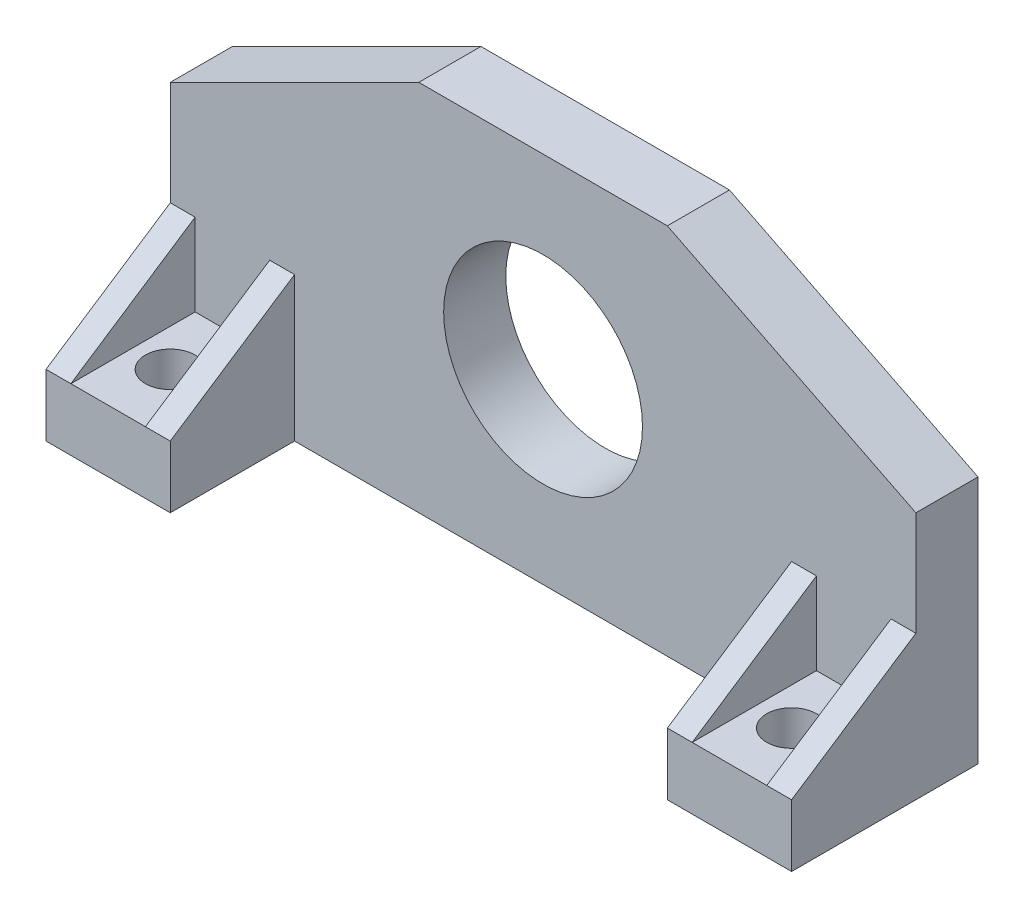
ISO-10303-21;
HEADER;
FILE_DESCRIPTION(('STEP AP214'),'2;1');
FILE_NAME('part.step','',(''),(''),'','','');
FILE_SCHEMA(('AUTOMOTIVE_DESIGN { 1 0 10303 214 1 1 1 1 }'));
ENDSEC;
DATA;
#1=APPLICATION_CONTEXT('core data for automotive mechanical design processes');
#2=APPLICATION_PROTOCOL_DEFINITION('international standard','automotive_design',2000,#1);
#3=PRODUCT_CONTEXT('',#1,'mechanical');
#4=PRODUCT('Part','Part','',(#3));
#5=PRODUCT_RELATED_PRODUCT_CATEGORY('part','',(#4));
#6=PRODUCT_DEFINITION_FORMATION('','',#4);
#7=PRODUCT_DEFINITION_CONTEXT('part definition',#1,'design');
#8=PRODUCT_DEFINITION('design','',#6,#7);
#9=PRODUCT_DEFINITION_SHAPE('','',#8);
#10=(LENGTH_UNIT() NAMED_UNIT(*) SI_UNIT(.MILLI.,.METRE.));
#11=(NAMED_UNIT(*) PLANE_ANGLE_UNIT() SI_UNIT($,.RADIAN.));
#12=(NAMED_UNIT(*) SI_UNIT($,.STERADIAN.) SOLID_ANGLE_UNIT());
#13=UNCERTAINTY_MEASURE_WITH_UNIT(LENGTH_MEASURE(1.E-05),#10,'distance_accuracy_value','');
#14=(GEOMETRIC_REPRESENTATION_CONTEXT(3) GLOBAL_UNCERTAINTY_ASSIGNED_CONTEXT((#13)) GLOBAL_UNIT_ASSIGNED_CONTEXT((#10,
#11,#12)) REPRESENTATION_CONTEXT('',''));
#15=CARTESIAN_POINT('',(0.,0.,0.));
#16=DIRECTION('',(0.,0.,1.));
#17=DIRECTION('',(1.,0.,0.));
#18=AXIS2_PLACEMENT_3D('',#15,#16,#17);
#19=CARTESIAN_POINT('',(0.,0.,5.));
#20=DIRECTION('',(0.,0.,-1.));
#21=DIRECTION('',(-1.,0.,0.));
#22=AXIS2_PLACEMENT_3D('',#19,#20,#21);
#23=PLANE('',#22);
#24=CARTESIAN_POINT('',(30.,15.,5.));
#25=DIRECTION('',(0.,0.,1.));
#26=DIRECTION('',(1.,0.,0.));
#27=AXIS2_PLACEMENT_3D('',#24,#25,#26);
#28=CIRCLE('',#27,8.);
#29=CARTESIAN_POINT('',(38.,15.,5.));
#30=VERTEX_POINT('',#29);
#31=EDGE_CURVE('E319',#30,#30,#28,.T.);
#32=ORIENTED_EDGE('',*,*,#31,.F.);
#33=EDGE_LOOP('',(#32));
#34=FACE_BOUND('',#33,.T.);
#35=DIRECTION('',(-0.894427190999916,0.447213595499957,0.));
#36=VECTOR('',#35,1.);
#37=CARTESIAN_POINT('',(40.,30.,5.));
#38=LINE('',#37,#36);
#39=CARTESIAN_POINT('',(60.,20.,5.));
#40=VERTEX_POINT('',#39);
#41=CARTESIAN_POINT('',(40.,30.,5.));
#42=VERTEX_POINT('',#41);
#43=EDGE_CURVE('E163',#40,#42,#38,.T.);
#44=ORIENTED_EDGE('',*,*,#43,.T.);
#45=DIRECTION('',(-1.,0.,0.));
#46=VECTOR('',#45,1.);
#47=CARTESIAN_POINT('',(0.,30.,5.));
#48=LINE('',#47,#46);
#49=CARTESIAN_POINT('',(20.,30.,5.));
#50=VERTEX_POINT('',#49);
#51=EDGE_CURVE('E167',#42,#50,#48,.T.);
#52=ORIENTED_EDGE('',*,*,#51,.T.);
#53=DIRECTION('',(0.894427190999916,0.447213595499958,0.));
#54=VECTOR('',#53,1.);
#55=CARTESIAN_POINT('',(20.,30.,5.));
#56=LINE('',#55,#54);
#57=CARTESIAN_POINT('',(0.,20.,5.));
#58=VERTEX_POINT('',#57);
#59=EDGE_CURVE('E203',#58,#50,#56,.T.);
#60=ORIENTED_EDGE('',*,*,#59,.F.);
#61=DIRECTION('',(0.,-1.,0.));
#62=VECTOR('',#61,1.);
#63=CARTESIAN_POINT('',(0.,0.,5.));
#64=LINE('',#63,#62);
#65=CARTESIAN_POINT('',(0.,11.6051878718082,5.));
#66=VERTEX_POINT('',#65);
#67=EDGE_CURVE('E173',#58,#66,#64,.T.);
#68=ORIENTED_EDGE('',*,*,#67,.T.);
#69=DIRECTION('',(-1.,0.,0.));
#70=VECTOR('',#69,1.);
#71=CARTESIAN_POINT('',(1.99999999999999,11.6051878718082,5.));
#72=LINE('',#71,#70);
#73=CARTESIAN_POINT('',(1.99999999999999,11.6051878718082,5.));
#74=VERTEX_POINT('',#73);
#75=EDGE_CURVE('E263',#74,#66,#72,.T.);
#76=ORIENTED_EDGE('',*,*,#75,.F.);
#77=DIRECTION('',(0.,-1.,0.));
#78=VECTOR('',#77,1.);
#79=CARTESIAN_POINT('',(1.99999999999999,11.6051878718082,5.));
#80=LINE('',#79,#78);
#81=CARTESIAN_POINT('',(2.,4.99999999999997,5.));
#82=VERTEX_POINT('',#81);
#83=EDGE_CURVE('E261',#74,#82,#80,.T.);
#84=ORIENTED_EDGE('',*,*,#83,.T.);
#85=DIRECTION('',(1.,0.,0.));
#86=VECTOR('',#85,1.);
#87=CARTESIAN_POINT('',(0.,4.99999999999997,5.));
#88=LINE('',#87,#86);
#89=CARTESIAN_POINT('',(8.,4.99999999999998,5.));
#90=VERTEX_POINT('',#89);
#91=EDGE_CURVE('E284',#82,#90,#88,.T.);
#92=ORIENTED_EDGE('',*,*,#91,.T.);
#93=DIRECTION('',(0.,-1.,0.));
#94=VECTOR('',#93,1.);
#95=CARTESIAN_POINT('',(7.99999999999999,11.6051878718082,5.));
#96=LINE('',#95,#94);
#97=CARTESIAN_POINT('',(7.99999999999999,11.6051878718082,5.));
#98=VERTEX_POINT('',#97);
#99=EDGE_CURVE('E240',#98,#90,#96,.T.);
#100=ORIENTED_EDGE('',*,*,#99,.F.);
#101=DIRECTION('',(1.,0.,0.));
#102=VECTOR('',#101,1.);
#103=CARTESIAN_POINT('',(7.99999999999999,11.6051878718082,5.));
#104=LINE('',#103,#102);
#105=CARTESIAN_POINT('',(9.99999999999999,11.6051878718082,5.));
#106=VERTEX_POINT('',#105);
#107=EDGE_CURVE('E246',#98,#106,#104,.T.);
#108=ORIENTED_EDGE('',*,*,#107,.T.);
#109=DIRECTION('',(0.,-1.,0.));
#110=VECTOR('',#109,1.);
#111=CARTESIAN_POINT('',(10.,0.,5.));
#112=LINE('',#111,#110);
#113=CARTESIAN_POINT('',(10.,0.,5.));
#114=VERTEX_POINT('',#113);
#115=EDGE_CURVE('E280',#106,#114,#112,.T.);
#116=ORIENTED_EDGE('',*,*,#115,.T.);
#117=DIRECTION('',(1.,0.,0.));
#118=VECTOR('',#117,1.);
#119=CARTESIAN_POINT('',(0.,0.,5.));
#120=LINE('',#119,#118);
#121=CARTESIAN_POINT('',(50.,0.,5.));
#122=VERTEX_POINT('',#121);
#123=EDGE_CURVE('E176',#114,#122,#120,.T.);
#124=ORIENTED_EDGE('',*,*,#123,.T.);
#125=DIRECTION('',(0.,-1.,0.));
#126=VECTOR('',#125,1.);
#127=CARTESIAN_POINT('',(50.,0.,5.));
#128=LINE('',#127,#126);
#129=CARTESIAN_POINT('',(50.,11.6051878718082,5.));
#130=VERTEX_POINT('',#129);
#131=EDGE_CURVE('E305',#130,#122,#128,.T.);
#132=ORIENTED_EDGE('',*,*,#131,.F.);
#133=DIRECTION('',(-1.,0.,0.));
#134=VECTOR('',#133,1.);
#135=CARTESIAN_POINT('',(52.,11.6051878718082,5.));
#136=LINE('',#135,#134);
#137=CARTESIAN_POINT('',(52.,11.6051878718082,5.));
#138=VERTEX_POINT('',#137);
#139=EDGE_CURVE('E231',#138,#130,#136,.T.);
#140=ORIENTED_EDGE('',*,*,#139,.F.);
#141=DIRECTION('',(0.,-1.,0.));
#142=VECTOR('',#141,1.);
#143=CARTESIAN_POINT('',(52.,11.6051878718082,5.));
#144=LINE('',#143,#142);
#145=CARTESIAN_POINT('',(52.,5.00000000000001,5.));
#146=VERTEX_POINT('',#145);
#147=EDGE_CURVE('E227',#138,#146,#144,.T.);
#148=ORIENTED_EDGE('',*,*,#147,.T.);
#149=DIRECTION('',(-1.,0.,0.));
#150=VECTOR('',#149,1.);
#151=CARTESIAN_POINT('',(60.,5.,5.));
#152=LINE('',#151,#150);
#153=CARTESIAN_POINT('',(58.,5.00000000000001,5.));
#154=VERTEX_POINT('',#153);
#155=EDGE_CURVE('E300',#154,#146,#152,.T.);
#156=ORIENTED_EDGE('',*,*,#155,.F.);
#157=DIRECTION('',(0.,-1.,0.));
#158=VECTOR('',#157,1.);
#159=CARTESIAN_POINT('',(58.,11.6051878718082,5.));
#160=LINE('',#159,#158);
#161=CARTESIAN_POINT('',(58.,11.6051878718082,5.));
#162=VERTEX_POINT('',#161);
#163=EDGE_CURVE('E210',#162,#154,#160,.T.);
#164=ORIENTED_EDGE('',*,*,#163,.F.);
#165=DIRECTION('',(1.,0.,0.));
#166=VECTOR('',#165,1.);
#167=CARTESIAN_POINT('',(58.,11.6051878718082,5.));
#168=LINE('',#167,#166);
#169=CARTESIAN_POINT('',(60.,11.6051878718082,5.));
#170=VERTEX_POINT('',#169);
#171=EDGE_CURVE('E208',#162,#170,#168,.T.);
#172=ORIENTED_EDGE('',*,*,#171,.T.);
#173=DIRECTION('',(0.,1.,0.));
#174=VECTOR('',#173,1.);
#175=CARTESIAN_POINT('',(60.,0.,5.));
#176=LINE('',#175,#174);
#177=EDGE_CURVE('E184',#170,#40,#176,.T.);
#178=ORIENTED_EDGE('',*,*,#177,.T.);
#179=EDGE_LOOP('',(#44,#52,#60,#68,#76,#84,#92,#100,#108,#116,#124,#132,#140,#148,#156,#164,
#172,#178));
#180=FACE_BOUND('',#179,.T.);
#181=ADVANCED_FACE('F32',(#34,#180),#23,.F.);
#182=CARTESIAN_POINT('',(60.,0.,5.));
#183=DIRECTION('',(-1.,0.,0.));
#184=DIRECTION('',(0.,-1.,0.));
#185=AXIS2_PLACEMENT_3D('',#182,#183,#184);
#186=PLANE('',#185);
#187=DIRECTION('',(0.,0.,1.));
#188=VECTOR('',#187,1.);
#189=CARTESIAN_POINT('',(60.,20.,0.));
#190=LINE('',#189,#188);
#191=CARTESIAN_POINT('',(60.,20.,0.));
#192=VERTEX_POINT('',#191);
#193=EDGE_CURVE('E47',#192,#40,#190,.T.);
#194=ORIENTED_EDGE('',*,*,#193,.T.);
#195=ORIENTED_EDGE('',*,*,#177,.F.);
#196=DIRECTION('',(0.,0.55114370580762,-0.834410340029798));
#197=VECTOR('',#196,1.);
#198=CARTESIAN_POINT('',(60.,5.,15.));
#199=LINE('',#198,#197);
#200=CARTESIAN_POINT('',(60.,5.,15.));
#201=VERTEX_POINT('',#200);
#202=EDGE_CURVE('E222',#201,#170,#199,.T.);
#203=ORIENTED_EDGE('',*,*,#202,.F.);
#204=DIRECTION('',(0.,1.,0.));
#205=VECTOR('',#204,1.);
#206=CARTESIAN_POINT('',(60.,0.,15.));
#207=LINE('',#206,#205);
#208=CARTESIAN_POINT('',(60.,0.,15.));
#209=VERTEX_POINT('',#208);
#210=EDGE_CURVE('E301',#209,#201,#207,.T.);
#211=ORIENTED_EDGE('',*,*,#210,.F.);
#212=DIRECTION('',(0.,0.,-1.));
#213=VECTOR('',#212,1.);
#214=CARTESIAN_POINT('',(60.,0.,5.));
#215=LINE('',#214,#213);
#216=CARTESIAN_POINT('',(60.,0.,0.));
#217=VERTEX_POINT('',#216);
#218=EDGE_CURVE('E40',#209,#217,#215,.T.);
#219=ORIENTED_EDGE('',*,*,#218,.T.);
#220=DIRECTION('',(0.,1.,0.));
#221=VECTOR('',#220,1.);
#222=CARTESIAN_POINT('',(60.,0.,0.));
#223=LINE('',#222,#221);
#224=EDGE_CURVE('E174',#217,#192,#223,.T.);
#225=ORIENTED_EDGE('',*,*,#224,.T.);
#226=EDGE_LOOP('',(#194,#195,#203,#211,#219,#225));
#227=FACE_BOUND('',#226,.T.);
#228=ADVANCED_FACE('F201',(#227),#186,.F.);
#229=CARTESIAN_POINT('',(0.,30.,5.));
#230=DIRECTION('',(0.,-1.,0.));
#231=DIRECTION('',(0.,0.,-1.));
#232=AXIS2_PLACEMENT_3D('',#229,#230,#231);
#233=PLANE('',#232);
#234=DIRECTION('',(0.,0.,1.));
#235=VECTOR('',#234,1.);
#236=CARTESIAN_POINT('',(40.,30.,0.));
#237=LINE('',#236,#235);
#238=CARTESIAN_POINT('',(40.,30.,0.));
#239=VERTEX_POINT('',#238);
#240=EDGE_CURVE('E158',#239,#42,#237,.T.);
#241=ORIENTED_EDGE('',*,*,#240,.F.);
#242=DIRECTION('',(-1.,0.,0.));
#243=VECTOR('',#242,1.);
#244=CARTESIAN_POINT('',(0.,30.,0.));
#245=LINE('',#244,#243);
#246=CARTESIAN_POINT('',(20.,30.,0.));
#247=VERTEX_POINT('',#246);
#248=EDGE_CURVE('E55',#239,#247,#245,.T.);
#249=ORIENTED_EDGE('',*,*,#248,.T.);
#250=DIRECTION('',(0.,0.,1.));
#251=VECTOR('',#250,1.);
#252=CARTESIAN_POINT('',(20.,30.,0.));
#253=LINE('',#252,#251);
#254=EDGE_CURVE('E332',#247,#50,#253,.T.);
#255=ORIENTED_EDGE('',*,*,#254,.T.);
#256=ORIENTED_EDGE('',*,*,#51,.F.);
#257=EDGE_LOOP('',(#241,#249,#255,#256));
#258=FACE_BOUND('',#257,.T.);
#259=ADVANCED_FACE('F166',(#258),#233,.F.);
#260=CARTESIAN_POINT('',(0.,0.,0.));
#261=DIRECTION('',(0.,0.,-1.));
#262=DIRECTION('',(-1.,0.,0.));
#263=AXIS2_PLACEMENT_3D('',#260,#261,#262);
#264=PLANE('',#263);
#265=CARTESIAN_POINT('',(30.,15.,0.));
#266=DIRECTION('',(0.,0.,1.));
#267=DIRECTION('',(1.,0.,0.));
#268=AXIS2_PLACEMENT_3D('',#265,#266,#267);
#269=CIRCLE('',#268,8.);
#270=CARTESIAN_POINT('',(38.,15.,0.));
#271=VERTEX_POINT('',#270);
#272=EDGE_CURVE('E194',#271,#271,#269,.T.);
#273=ORIENTED_EDGE('',*,*,#272,.T.);
#274=EDGE_LOOP('',(#273));
#275=FACE_BOUND('',#274,.T.);
#276=ORIENTED_EDGE('',*,*,#248,.F.);
#277=DIRECTION('',(-0.894427190999916,0.447213595499957,0.));
#278=VECTOR('',#277,1.);
#279=CARTESIAN_POINT('',(40.,30.,0.));
#280=LINE('',#279,#278);
#281=EDGE_CURVE('E156',#192,#239,#280,.T.);
#282=ORIENTED_EDGE('',*,*,#281,.F.);
#283=ORIENTED_EDGE('',*,*,#224,.F.);
#284=DIRECTION('',(1.,0.,0.));
#285=VECTOR('',#284,1.);
#286=CARTESIAN_POINT('',(0.,0.,0.));
#287=LINE('',#286,#285);
#288=CARTESIAN_POINT('',(0.,0.,0.));
#289=VERTEX_POINT('',#288);
#290=EDGE_CURVE('E178',#289,#217,#287,.T.);
#291=ORIENTED_EDGE('',*,*,#290,.F.);
#292=DIRECTION('',(0.,-1.,0.));
#293=VECTOR('',#292,1.);
#294=CARTESIAN_POINT('',(0.,0.,0.));
#295=LINE('',#294,#293);
#296=CARTESIAN_POINT('',(0.,20.,0.));
#297=VERTEX_POINT('',#296);
#298=EDGE_CURVE('E193',#297,#289,#295,.T.);
#299=ORIENTED_EDGE('',*,*,#298,.F.);
#300=DIRECTION('',(0.894427190999916,0.447213595499958,0.));
#301=VECTOR('',#300,1.);
#302=CARTESIAN_POINT('',(20.,30.,0.));
#303=LINE('',#302,#301);
#304=EDGE_CURVE('E172',#297,#247,#303,.T.);
#305=ORIENTED_EDGE('',*,*,#304,.T.);
#306=EDGE_LOOP('',(#276,#282,#283,#291,#299,#305));
#307=FACE_BOUND('',#306,.T.);
#308=ADVANCED_FACE('F170',(#275,#307),#264,.T.);
#309=CARTESIAN_POINT('',(0.,0.,5.));
#310=DIRECTION('',(1.,0.,0.));
#311=DIRECTION('',(0.,1.,0.));
#312=AXIS2_PLACEMENT_3D('',#309,#310,#311);
#313=PLANE('',#312);
#314=ORIENTED_EDGE('',*,*,#67,.F.);
#315=DIRECTION('',(0.,0.,1.));
#316=VECTOR('',#315,1.);
#317=CARTESIAN_POINT('',(0.,20.,0.));
#318=LINE('',#317,#316);
#319=EDGE_CURVE('E350',#297,#58,#318,.T.);
#320=ORIENTED_EDGE('',*,*,#319,.F.);
#321=ORIENTED_EDGE('',*,*,#298,.T.);
#322=DIRECTION('',(0.,0.,-1.));
#323=VECTOR('',#322,1.);
#324=CARTESIAN_POINT('',(0.,0.,5.));
#325=LINE('',#324,#323);
#326=CARTESIAN_POINT('',(0.,0.,15.));
#327=VERTEX_POINT('',#326);
#328=EDGE_CURVE('E11',#327,#289,#325,.T.);
#329=ORIENTED_EDGE('',*,*,#328,.F.);
#330=DIRECTION('',(0.,1.,0.));
#331=VECTOR('',#330,1.);
#332=CARTESIAN_POINT('',(0.,0.,15.));
#333=LINE('',#332,#331);
#334=CARTESIAN_POINT('',(0.,4.99999999999997,15.));
#335=VERTEX_POINT('',#334);
#336=EDGE_CURVE('E281',#327,#335,#333,.T.);
#337=ORIENTED_EDGE('',*,*,#336,.T.);
#338=DIRECTION('',(0.,0.55114370580762,-0.834410340029798));
#339=VECTOR('',#338,1.);
#340=CARTESIAN_POINT('',(0.,4.99999999999997,15.));
#341=LINE('',#340,#339);
#342=EDGE_CURVE('E252',#335,#66,#341,.T.);
#343=ORIENTED_EDGE('',*,*,#342,.T.);
#344=EDGE_LOOP('',(#314,#320,#321,#329,#337,#343));
#345=FACE_BOUND('',#344,.T.);
#346=ADVANCED_FACE('F34',(#345),#313,.F.);
#347=CARTESIAN_POINT('',(0.,0.,5.));
#348=DIRECTION('',(0.,1.,0.));
#349=DIRECTION('',(0.,0.,1.));
#350=AXIS2_PLACEMENT_3D('',#347,#348,#349);
#351=PLANE('',#350);
#352=CARTESIAN_POINT('',(55.,0.,10.));
#353=DIRECTION('',(0.,1.,0.));
#354=DIRECTION('',(0.,0.,1.));
#355=AXIS2_PLACEMENT_3D('',#352,#353,#354);
#356=CIRCLE('',#355,2.);
#357=CARTESIAN_POINT('',(55.,0.,12.));
#358=VERTEX_POINT('',#357);
#359=EDGE_CURVE('E271',#358,#358,#356,.F.);
#360=ORIENTED_EDGE('',*,*,#359,.F.);
#361=EDGE_LOOP('',(#360));
#362=FACE_BOUND('',#361,.T.);
#363=CARTESIAN_POINT('',(5.,0.,10.));
#364=DIRECTION('',(0.,1.,0.));
#365=DIRECTION('',(0.,0.,1.));
#366=AXIS2_PLACEMENT_3D('',#363,#364,#365);
#367=CIRCLE('',#366,2.);
#368=CARTESIAN_POINT('',(5.,0.,12.));
#369=VERTEX_POINT('',#368);
#370=EDGE_CURVE('E277',#369,#369,#367,.T.);
#371=ORIENTED_EDGE('',*,*,#370,.T.);
#372=EDGE_LOOP('',(#371));
#373=FACE_BOUND('',#372,.T.);
#374=ORIENTED_EDGE('',*,*,#290,.T.);
#375=ORIENTED_EDGE('',*,*,#218,.F.);
#376=DIRECTION('',(1.,0.,0.));
#377=VECTOR('',#376,1.);
#378=CARTESIAN_POINT('',(60.,0.,15.));
#379=LINE('',#378,#377);
#380=CARTESIAN_POINT('',(50.,0.,15.));
#381=VERTEX_POINT('',#380);
#382=EDGE_CURVE('E311',#381,#209,#379,.T.);
#383=ORIENTED_EDGE('',*,*,#382,.F.);
#384=DIRECTION('',(0.,0.,-1.));
#385=VECTOR('',#384,1.);
#386=CARTESIAN_POINT('',(50.,0.,15.));
#387=LINE('',#386,#385);
#388=EDGE_CURVE('E313',#381,#122,#387,.T.);
#389=ORIENTED_EDGE('',*,*,#388,.T.);
#390=ORIENTED_EDGE('',*,*,#123,.F.);
#391=DIRECTION('',(0.,0.,-1.));
#392=VECTOR('',#391,1.);
#393=CARTESIAN_POINT('',(10.,0.,15.));
#394=LINE('',#393,#392);
#395=CARTESIAN_POINT('',(10.,0.,15.));
#396=VERTEX_POINT('',#395);
#397=EDGE_CURVE('E293',#396,#114,#394,.T.);
#398=ORIENTED_EDGE('',*,*,#397,.F.);
#399=DIRECTION('',(-1.,0.,0.));
#400=VECTOR('',#399,1.);
#401=CARTESIAN_POINT('',(0.,0.,15.));
#402=LINE('',#401,#400);
#403=EDGE_CURVE('E283',#396,#327,#402,.T.);
#404=ORIENTED_EDGE('',*,*,#403,.T.);
#405=ORIENTED_EDGE('',*,*,#328,.T.);
#406=EDGE_LOOP('',(#374,#375,#383,#389,#390,#398,#404,#405));
#407=FACE_BOUND('',#406,.T.);
#408=ADVANCED_FACE('F197',(#362,#373,#407),#351,.F.);
#409=CARTESIAN_POINT('',(30.,15.,0.));
#410=DIRECTION('',(0.,0.,1.));
#411=DIRECTION('',(1.,0.,0.));
#412=AXIS2_PLACEMENT_3D('',#409,#410,#411);
#413=CYLINDRICAL_SURFACE('',#412,8.);
#414=ORIENTED_EDGE('',*,*,#272,.F.);
#415=EDGE_LOOP('',(#414));
#416=FACE_BOUND('',#415,.T.);
#417=ORIENTED_EDGE('',*,*,#31,.T.);
#418=EDGE_LOOP('',(#417));
#419=FACE_BOUND('',#418,.T.);
#420=ADVANCED_FACE('F397',(#416,#419),#413,.F.);
#421=CARTESIAN_POINT('',(60.,5.,15.));
#422=DIRECTION('',(0.,-1.,0.));
#423=DIRECTION('',(1.,0.,0.));
#424=AXIS2_PLACEMENT_3D('',#421,#422,#423);
#425=PLANE('',#424);
#426=CARTESIAN_POINT('',(55.,5.,10.));
#427=DIRECTION('',(0.,-1.,0.));
#428=DIRECTION('',(1.,0.,0.));
#429=AXIS2_PLACEMENT_3D('',#426,#427,#428);
#430=CIRCLE('',#429,2.);
#431=CARTESIAN_POINT('',(57.,5.,10.));
#432=VERTEX_POINT('',#431);
#433=EDGE_CURVE('E268',#432,#432,#430,.T.);
#434=ORIENTED_EDGE('',*,*,#433,.T.);
#435=EDGE_LOOP('',(#434));
#436=FACE_BOUND('',#435,.T.);
#437=DIRECTION('',(-1.,0.,0.));
#438=VECTOR('',#437,1.);
#439=CARTESIAN_POINT('',(60.,5.,15.));
#440=LINE('',#439,#438);
#441=CARTESIAN_POINT('',(58.,5.,15.));
#442=VERTEX_POINT('',#441);
#443=CARTESIAN_POINT('',(52.,5.,15.));
#444=VERTEX_POINT('',#443);
#445=EDGE_CURVE('E304',#442,#444,#440,.T.);
#446=ORIENTED_EDGE('',*,*,#445,.F.);
#447=DIRECTION('',(0.,0.,1.));
#448=VECTOR('',#447,1.);
#449=CARTESIAN_POINT('',(58.,5.00000000000001,5.));
#450=LINE('',#449,#448);
#451=EDGE_CURVE('E331',#154,#442,#450,.T.);
#452=ORIENTED_EDGE('',*,*,#451,.F.);
#453=ORIENTED_EDGE('',*,*,#155,.T.);
#454=DIRECTION('',(0.,0.,1.));
#455=VECTOR('',#454,1.);
#456=CARTESIAN_POINT('',(52.,5.00000000000001,5.));
#457=LINE('',#456,#455);
#458=EDGE_CURVE('E217',#146,#444,#457,.T.);
#459=ORIENTED_EDGE('',*,*,#458,.T.);
#460=EDGE_LOOP('',(#446,#452,#453,#459));
#461=FACE_BOUND('',#460,.T.);
#462=ADVANCED_FACE('F345',(#436,#461),#425,.F.);
#463=CARTESIAN_POINT('',(50.,0.,15.));
#464=DIRECTION('',(1.,0.,0.));
#465=DIRECTION('',(0.,0.,-1.));
#466=AXIS2_PLACEMENT_3D('',#463,#464,#465);
#467=PLANE('',#466);
#468=ORIENTED_EDGE('',*,*,#131,.T.);
#469=ORIENTED_EDGE('',*,*,#388,.F.);
#470=DIRECTION('',(0.,-1.,0.));
#471=VECTOR('',#470,1.);
#472=CARTESIAN_POINT('',(50.,0.,15.));
#473=LINE('',#472,#471);
#474=CARTESIAN_POINT('',(50.,5.,15.));
#475=VERTEX_POINT('',#474);
#476=EDGE_CURVE('E309',#475,#381,#473,.T.);
#477=ORIENTED_EDGE('',*,*,#476,.F.);
#478=DIRECTION('',(0.,0.55114370580762,-0.834410340029798));
#479=VECTOR('',#478,1.);
#480=CARTESIAN_POINT('',(50.,5.,15.));
#481=LINE('',#480,#479);
#482=EDGE_CURVE('E213',#475,#130,#481,.T.);
#483=ORIENTED_EDGE('',*,*,#482,.T.);
#484=EDGE_LOOP('',(#468,#469,#477,#483));
#485=FACE_BOUND('',#484,.T.);
#486=ADVANCED_FACE('F326',(#485),#467,.F.);
#487=CARTESIAN_POINT('',(0.,0.,15.));
#488=DIRECTION('',(0.,0.,1.));
#489=DIRECTION('',(1.,0.,0.));
#490=AXIS2_PLACEMENT_3D('',#487,#488,#489);
#491=PLANE('',#490);
#492=ORIENTED_EDGE('',*,*,#210,.T.);
#493=EDGE_CURVE('E306',#201,#442,#440,.T.);
#494=ORIENTED_EDGE('',*,*,#493,.T.);
#495=ORIENTED_EDGE('',*,*,#445,.T.);
#496=DIRECTION('',(-1.,0.,0.));
#497=VECTOR('',#496,1.);
#498=CARTESIAN_POINT('',(52.,5.,15.));
#499=LINE('',#498,#497);
#500=EDGE_CURVE('E229',#444,#475,#499,.T.);
#501=ORIENTED_EDGE('',*,*,#500,.T.);
#502=ORIENTED_EDGE('',*,*,#476,.T.);
#503=ORIENTED_EDGE('',*,*,#382,.T.);
#504=EDGE_LOOP('',(#492,#494,#495,#501,#502,#503));
#505=FACE_BOUND('',#504,.T.);
#506=ADVANCED_FACE('F329',(#505),#491,.T.);
#507=CARTESIAN_POINT('',(10.,0.,15.));
#508=DIRECTION('',(1.,0.,0.));
#509=DIRECTION('',(0.,1.,0.));
#510=AXIS2_PLACEMENT_3D('',#507,#508,#509);
#511=PLANE('',#510);
#512=ORIENTED_EDGE('',*,*,#115,.F.);
#513=DIRECTION('',(0.,0.55114370580762,-0.834410340029798));
#514=VECTOR('',#513,1.);
#515=CARTESIAN_POINT('',(10.,4.99999999999998,15.));
#516=LINE('',#515,#514);
#517=CARTESIAN_POINT('',(10.,4.99999999999998,15.));
#518=VERTEX_POINT('',#517);
#519=EDGE_CURVE('E234',#518,#106,#516,.T.);
#520=ORIENTED_EDGE('',*,*,#519,.F.);
#521=DIRECTION('',(0.,-1.,0.));
#522=VECTOR('',#521,1.);
#523=CARTESIAN_POINT('',(10.,0.,15.));
#524=LINE('',#523,#522);
#525=EDGE_CURVE('E286',#518,#396,#524,.T.);
#526=ORIENTED_EDGE('',*,*,#525,.T.);
#527=ORIENTED_EDGE('',*,*,#397,.T.);
#528=EDGE_LOOP('',(#512,#520,#526,#527));
#529=FACE_BOUND('',#528,.T.);
#530=ADVANCED_FACE('F430',(#529),#511,.T.);
#531=CARTESIAN_POINT('',(0.,4.99999999999997,15.));
#532=DIRECTION('',(0.,1.,0.));
#533=DIRECTION('',(-1.,0.,0.));
#534=AXIS2_PLACEMENT_3D('',#531,#532,#533);
#535=PLANE('',#534);
#536=DIRECTION('',(0.,0.,1.));
#537=VECTOR('',#536,1.);
#538=CARTESIAN_POINT('',(8.,4.99999999999999,5.));
#539=LINE('',#538,#537);
#540=CARTESIAN_POINT('',(7.99999999999999,4.99999999999998,15.));
#541=VERTEX_POINT('',#540);
#542=EDGE_CURVE('E237',#90,#541,#539,.T.);
#543=ORIENTED_EDGE('',*,*,#542,.F.);
#544=ORIENTED_EDGE('',*,*,#91,.F.);
#545=DIRECTION('',(0.,0.,1.));
#546=VECTOR('',#545,1.);
#547=CARTESIAN_POINT('',(2.,4.99999999999998,5.));
#548=LINE('',#547,#546);
#549=CARTESIAN_POINT('',(2.,4.99999999999997,15.));
#550=VERTEX_POINT('',#549);
#551=EDGE_CURVE('E255',#82,#550,#548,.T.);
#552=ORIENTED_EDGE('',*,*,#551,.T.);
#553=DIRECTION('',(1.,0.,0.));
#554=VECTOR('',#553,1.);
#555=CARTESIAN_POINT('',(0.,4.99999999999997,15.));
#556=LINE('',#555,#554);
#557=EDGE_CURVE('E289',#550,#541,#556,.T.);
#558=ORIENTED_EDGE('',*,*,#557,.T.);
#559=EDGE_LOOP('',(#543,#544,#552,#558));
#560=FACE_BOUND('',#559,.T.);
#561=CARTESIAN_POINT('',(4.99999999999999,4.99999999999998,10.));
#562=DIRECTION('',(0.,1.,0.));
#563=DIRECTION('',(-1.,0.,0.));
#564=AXIS2_PLACEMENT_3D('',#561,#562,#563);
#565=CIRCLE('',#564,2.);
#566=CARTESIAN_POINT('',(2.99999999999999,4.99999999999998,10.));
#567=VERTEX_POINT('',#566);
#568=EDGE_CURVE('E274',#567,#567,#565,.T.);
#569=ORIENTED_EDGE('',*,*,#568,.F.);
#570=EDGE_LOOP('',(#569));
#571=FACE_BOUND('',#570,.T.);
#572=ADVANCED_FACE('F371',(#560,#571),#535,.T.);
#573=CARTESIAN_POINT('',(60.,0.,15.));
#574=DIRECTION('',(0.,0.,1.));
#575=DIRECTION('',(-1.,0.,0.));
#576=AXIS2_PLACEMENT_3D('',#573,#574,#575);
#577=PLANE('',#576);
#578=ORIENTED_EDGE('',*,*,#336,.F.);
#579=ORIENTED_EDGE('',*,*,#403,.F.);
#580=ORIENTED_EDGE('',*,*,#525,.F.);
#581=DIRECTION('',(1.,0.,0.));
#582=VECTOR('',#581,1.);
#583=CARTESIAN_POINT('',(8.,4.99999999999998,15.));
#584=LINE('',#583,#582);
#585=EDGE_CURVE('E249',#541,#518,#584,.T.);
#586=ORIENTED_EDGE('',*,*,#585,.F.);
#587=ORIENTED_EDGE('',*,*,#557,.F.);
#588=EDGE_CURVE('E290',#335,#550,#556,.T.);
#589=ORIENTED_EDGE('',*,*,#588,.F.);
#590=EDGE_LOOP('',(#578,#579,#580,#586,#587,#589));
#591=FACE_BOUND('',#590,.T.);
#592=ADVANCED_FACE('F416',(#591),#577,.T.);
#593=CARTESIAN_POINT('',(5.,-5.00000000000002,10.));
#594=DIRECTION('',(0.,1.,0.));
#595=DIRECTION('',(-1.,0.,0.));
#596=AXIS2_PLACEMENT_3D('',#593,#594,#595);
#597=CYLINDRICAL_SURFACE('',#596,2.);
#598=ORIENTED_EDGE('',*,*,#568,.T.);
#599=EDGE_LOOP('',(#598));
#600=FACE_BOUND('',#599,.T.);
#601=ORIENTED_EDGE('',*,*,#370,.F.);
#602=EDGE_LOOP('',(#601));
#603=FACE_BOUND('',#602,.T.);
#604=ADVANCED_FACE('F414',(#600,#603),#597,.F.);
#605=CARTESIAN_POINT('',(55.,-5.,10.));
#606=DIRECTION('',(0.,1.,0.));
#607=DIRECTION('',(-1.,0.,0.));
#608=AXIS2_PLACEMENT_3D('',#605,#606,#607);
#609=CYLINDRICAL_SURFACE('',#608,2.);
#610=ORIENTED_EDGE('',*,*,#433,.F.);
#611=EDGE_LOOP('',(#610));
#612=FACE_BOUND('',#611,.T.);
#613=ORIENTED_EDGE('',*,*,#359,.T.);
#614=EDGE_LOOP('',(#613));
#615=FACE_BOUND('',#614,.T.);
#616=ADVANCED_FACE('F385',(#612,#615),#609,.F.);
#617=CARTESIAN_POINT('',(2.,4.99999999999997,15.));
#618=DIRECTION('',(0.,0.834410340029798,0.55114370580762));
#619=DIRECTION('',(0.,-0.55114370580762,0.834410340029798));
#620=AXIS2_PLACEMENT_3D('',#617,#618,#619);
#621=PLANE('',#620);
#622=ORIENTED_EDGE('',*,*,#342,.F.);
#623=ORIENTED_EDGE('',*,*,#588,.T.);
#624=DIRECTION('',(0.,0.55114370580762,-0.834410340029798));
#625=VECTOR('',#624,1.);
#626=CARTESIAN_POINT('',(2.,4.99999999999997,15.));
#627=LINE('',#626,#625);
#628=EDGE_CURVE('E258',#550,#74,#627,.T.);
#629=ORIENTED_EDGE('',*,*,#628,.T.);
#630=ORIENTED_EDGE('',*,*,#75,.T.);
#631=EDGE_LOOP('',(#622,#623,#629,#630));
#632=FACE_BOUND('',#631,.T.);
#633=ADVANCED_FACE('F364',(#632),#621,.T.);
#634=CARTESIAN_POINT('',(2.,0.,0.));
#635=DIRECTION('',(1.,0.,0.));
#636=DIRECTION('',(0.,1.,0.));
#637=AXIS2_PLACEMENT_3D('',#634,#635,#636);
#638=PLANE('',#637);
#639=ORIENTED_EDGE('',*,*,#551,.F.);
#640=ORIENTED_EDGE('',*,*,#83,.F.);
#641=ORIENTED_EDGE('',*,*,#628,.F.);
#642=EDGE_LOOP('',(#639,#640,#641));
#643=FACE_BOUND('',#642,.T.);
#644=ADVANCED_FACE('F374',(#643),#638,.T.);
#645=CARTESIAN_POINT('',(8.,4.99999999999998,15.));
#646=DIRECTION('',(0.,-0.834410340029798,-0.55114370580762));
#647=DIRECTION('',(0.,0.55114370580762,-0.834410340029798));
#648=AXIS2_PLACEMENT_3D('',#645,#646,#647);
#649=PLANE('',#648);
#650=ORIENTED_EDGE('',*,*,#519,.T.);
#651=ORIENTED_EDGE('',*,*,#107,.F.);
#652=DIRECTION('',(0.,0.55114370580762,-0.834410340029798));
#653=VECTOR('',#652,1.);
#654=CARTESIAN_POINT('',(8.,4.99999999999998,15.));
#655=LINE('',#654,#653);
#656=EDGE_CURVE('E243',#541,#98,#655,.T.);
#657=ORIENTED_EDGE('',*,*,#656,.F.);
#658=ORIENTED_EDGE('',*,*,#585,.T.);
#659=EDGE_LOOP('',(#650,#651,#657,#658));
#660=FACE_BOUND('',#659,.T.);
#661=ADVANCED_FACE('F376',(#660),#649,.F.);
#662=CARTESIAN_POINT('',(8.,0.,0.));
#663=DIRECTION('',(-1.,0.,0.));
#664=DIRECTION('',(0.,1.,0.));
#665=AXIS2_PLACEMENT_3D('',#662,#663,#664);
#666=PLANE('',#665);
#667=ORIENTED_EDGE('',*,*,#542,.T.);
#668=ORIENTED_EDGE('',*,*,#656,.T.);
#669=ORIENTED_EDGE('',*,*,#99,.T.);
#670=EDGE_LOOP('',(#667,#668,#669));
#671=FACE_BOUND('',#670,.T.);
#672=ADVANCED_FACE('F382',(#671),#666,.T.);
#673=CARTESIAN_POINT('',(52.,5.,15.));
#674=DIRECTION('',(0.,0.834410340029798,0.55114370580762));
#675=DIRECTION('',(0.,-0.55114370580762,0.834410340029798));
#676=AXIS2_PLACEMENT_3D('',#673,#674,#675);
#677=PLANE('',#676);
#678=ORIENTED_EDGE('',*,*,#482,.F.);
#679=ORIENTED_EDGE('',*,*,#500,.F.);
#680=DIRECTION('',(0.,0.55114370580762,-0.834410340029798));
#681=VECTOR('',#680,1.);
#682=CARTESIAN_POINT('',(52.,5.,15.));
#683=LINE('',#682,#681);
#684=EDGE_CURVE('E225',#444,#138,#683,.T.);
#685=ORIENTED_EDGE('',*,*,#684,.T.);
#686=ORIENTED_EDGE('',*,*,#139,.T.);
#687=EDGE_LOOP('',(#678,#679,#685,#686));
#688=FACE_BOUND('',#687,.T.);
#689=ADVANCED_FACE('F340',(#688),#677,.T.);
#690=CARTESIAN_POINT('',(52.,0.,0.));
#691=DIRECTION('',(1.,0.,0.));
#692=DIRECTION('',(0.,1.,0.));
#693=AXIS2_PLACEMENT_3D('',#690,#691,#692);
#694=PLANE('',#693);
#695=ORIENTED_EDGE('',*,*,#458,.F.);
#696=ORIENTED_EDGE('',*,*,#147,.F.);
#697=ORIENTED_EDGE('',*,*,#684,.F.);
#698=EDGE_LOOP('',(#695,#696,#697));
#699=FACE_BOUND('',#698,.T.);
#700=ADVANCED_FACE('F344',(#699),#694,.T.);
#701=CARTESIAN_POINT('',(58.,5.,15.));
#702=DIRECTION('',(0.,-0.834410340029798,-0.55114370580762));
#703=DIRECTION('',(0.,0.55114370580762,-0.834410340029798));
#704=AXIS2_PLACEMENT_3D('',#701,#702,#703);
#705=PLANE('',#704);
#706=ORIENTED_EDGE('',*,*,#202,.T.);
#707=ORIENTED_EDGE('',*,*,#171,.F.);
#708=DIRECTION('',(0.,0.55114370580762,-0.834410340029798));
#709=VECTOR('',#708,1.);
#710=CARTESIAN_POINT('',(58.,5.,15.));
#711=LINE('',#710,#709);
#712=EDGE_CURVE('E214',#442,#162,#711,.T.);
#713=ORIENTED_EDGE('',*,*,#712,.F.);
#714=ORIENTED_EDGE('',*,*,#493,.F.);
#715=EDGE_LOOP('',(#706,#707,#713,#714));
#716=FACE_BOUND('',#715,.T.);
#717=ADVANCED_FACE('F333',(#716),#705,.F.);
#718=CARTESIAN_POINT('',(58.,0.,0.));
#719=DIRECTION('',(-1.,0.,0.));
#720=DIRECTION('',(0.,1.,0.));
#721=AXIS2_PLACEMENT_3D('',#718,#719,#720);
#722=PLANE('',#721);
#723=ORIENTED_EDGE('',*,*,#451,.T.);
#724=ORIENTED_EDGE('',*,*,#712,.T.);
#725=ORIENTED_EDGE('',*,*,#163,.T.);
#726=EDGE_LOOP('',(#723,#724,#725));
#727=FACE_BOUND('',#726,.T.);
#728=ADVANCED_FACE('F501',(#727),#722,.T.);
#729=CARTESIAN_POINT('',(20.,30.,0.));
#730=DIRECTION('',(0.447213595499958,-0.894427190999916,0.));
#731=DIRECTION('',(0.894427190999916,0.447213595499958,0.));
#732=AXIS2_PLACEMENT_3D('',#729,#730,#731);
#733=PLANE('',#732);
#734=ORIENTED_EDGE('',*,*,#59,.T.);
#735=ORIENTED_EDGE('',*,*,#254,.F.);
#736=ORIENTED_EDGE('',*,*,#304,.F.);
#737=ORIENTED_EDGE('',*,*,#319,.T.);
#738=EDGE_LOOP('',(#734,#735,#736,#737));
#739=FACE_BOUND('',#738,.T.);
#740=ADVANCED_FACE('F356',(#739),#733,.F.);
#741=CARTESIAN_POINT('',(40.,30.,0.));
#742=DIRECTION('',(0.447213595499957,0.894427190999916,0.));
#743=DIRECTION('',(-0.894427190999916,0.447213595499957,0.));
#744=AXIS2_PLACEMENT_3D('',#741,#742,#743);
#745=PLANE('',#744);
#746=ORIENTED_EDGE('',*,*,#43,.F.);
#747=ORIENTED_EDGE('',*,*,#193,.F.);
#748=ORIENTED_EDGE('',*,*,#281,.T.);
#749=ORIENTED_EDGE('',*,*,#240,.T.);
#750=EDGE_LOOP('',(#746,#747,#748,#749));
#751=FACE_BOUND('',#750,.T.);
#752=ADVANCED_FACE('F157',(#751),#745,.T.);
#753=CLOSED_SHELL('',(#181,#228,#259,#308,#346,#408,#420,#462,#486,#506,#530,#572,#592,#604,
#616,#633,#644,#661,#672,#689,#700,#717,#728,#740,#752));
#754=MANIFOLD_SOLID_BREP('B2',#753);
#755=ADVANCED_BREP_SHAPE_REPRESENTATION('',(#18,#754),#14);
#756=SHAPE_DEFINITION_REPRESENTATION(#9,#755);
ENDSEC;
END-ISO-10303-21;
